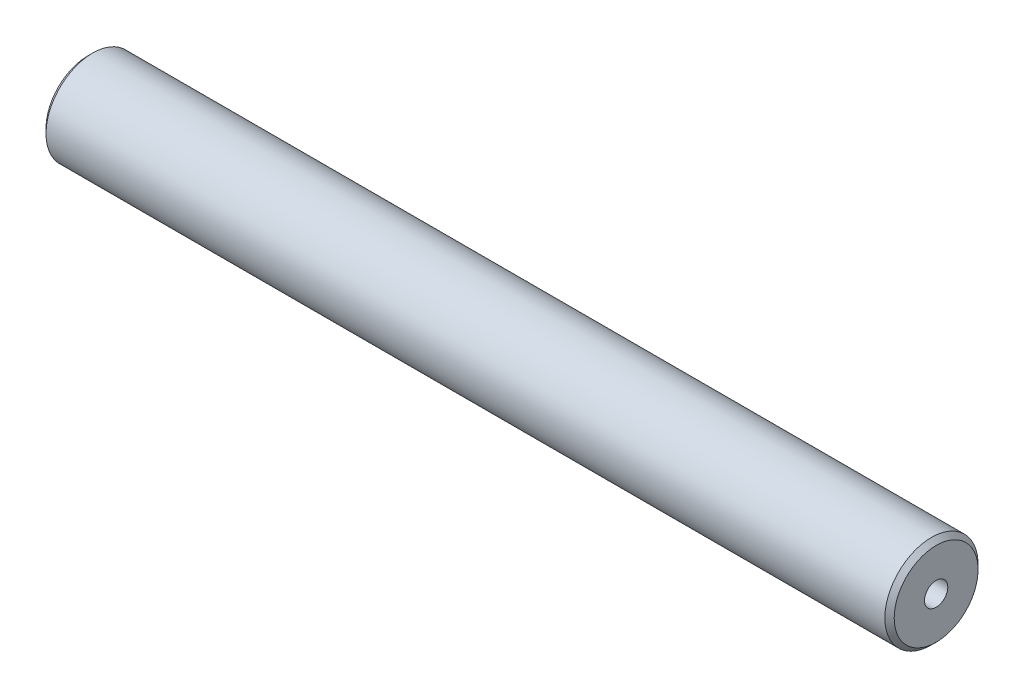
ISO-10303-21;
HEADER;
FILE_DESCRIPTION(('STEP AP214'),'2;1');
FILE_NAME('part.step','',(''),(''),'','','');
FILE_SCHEMA(('AUTOMOTIVE_DESIGN { 1 0 10303 214 1 1 1 1 }'));
ENDSEC;
DATA;
#1=APPLICATION_CONTEXT('core data for automotive mechanical design processes');
#2=APPLICATION_PROTOCOL_DEFINITION('international standard','automotive_design',2000,#1);
#3=PRODUCT_CONTEXT('',#1,'mechanical');
#4=PRODUCT('Part','Part','',(#3));
#5=PRODUCT_RELATED_PRODUCT_CATEGORY('part','',(#4));
#6=PRODUCT_DEFINITION_FORMATION('','',#4);
#7=PRODUCT_DEFINITION_CONTEXT('part definition',#1,'design');
#8=PRODUCT_DEFINITION('design','',#6,#7);
#9=PRODUCT_DEFINITION_SHAPE('','',#8);
#10=(LENGTH_UNIT() NAMED_UNIT(*) SI_UNIT(.MILLI.,.METRE.));
#11=(NAMED_UNIT(*) PLANE_ANGLE_UNIT() SI_UNIT($,.RADIAN.));
#12=(NAMED_UNIT(*) SI_UNIT($,.STERADIAN.) SOLID_ANGLE_UNIT());
#13=UNCERTAINTY_MEASURE_WITH_UNIT(LENGTH_MEASURE(1.E-05),#10,'distance_accuracy_value','');
#14=(GEOMETRIC_REPRESENTATION_CONTEXT(3) GLOBAL_UNCERTAINTY_ASSIGNED_CONTEXT((#13)) GLOBAL_UNIT_ASSIGNED_CONTEXT((#10,
#11,#12)) REPRESENTATION_CONTEXT('',''));
#15=CARTESIAN_POINT('',(0.,0.,0.));
#16=DIRECTION('',(0.,0.,1.));
#17=DIRECTION('',(1.,0.,0.));
#18=AXIS2_PLACEMENT_3D('',#15,#16,#17);
#19=CARTESIAN_POINT('',(0.,0.,0.));
#20=DIRECTION('',(1.,0.,0.));
#21=DIRECTION('',(0.,0.,-1.));
#22=AXIS2_PLACEMENT_3D('',#19,#20,#21);
#23=PLANE('',#22);
#24=CARTESIAN_POINT('',(0.,0.,0.));
#25=DIRECTION('',(-1.,0.,0.));
#26=DIRECTION('',(0.,0.,1.));
#27=AXIS2_PLACEMENT_3D('',#24,#25,#26);
#28=CIRCLE('',#27,2.5);
#29=CARTESIAN_POINT('',(0.,0.,2.5));
#30=VERTEX_POINT('',#29);
#31=EDGE_CURVE('E61',#30,#30,#28,.T.);
#32=ORIENTED_EDGE('',*,*,#31,.F.);
#33=EDGE_LOOP('',(#32));
#34=FACE_BOUND('',#33,.T.);
#35=CARTESIAN_POINT('',(0.,0.,0.));
#36=DIRECTION('',(1.,0.,0.));
#37=DIRECTION('',(0.,0.,-1.));
#38=AXIS2_PLACEMENT_3D('',#35,#36,#37);
#39=CIRCLE('',#38,8.99999999999998);
#40=CARTESIAN_POINT('',(0.,0.,-8.99999999999998));
#41=VERTEX_POINT('',#40);
#42=EDGE_CURVE('E11',#41,#41,#39,.F.);
#43=ORIENTED_EDGE('',*,*,#42,.T.);
#44=EDGE_LOOP('',(#43));
#45=FACE_BOUND('',#44,.T.);
#46=ADVANCED_FACE('F36',(#34,#45),#23,.F.);
#47=CARTESIAN_POINT('',(0.,0.,0.));
#48=DIRECTION('',(-1.,0.,0.));
#49=DIRECTION('',(0.,0.,1.));
#50=AXIS2_PLACEMENT_3D('',#47,#48,#49);
#51=CYLINDRICAL_SURFACE('',#50,10.);
#52=CARTESIAN_POINT('',(181.,0.,0.));
#53=DIRECTION('',(-1.,0.,0.));
#54=DIRECTION('',(0.,0.,1.));
#55=AXIS2_PLACEMENT_3D('',#52,#53,#54);
#56=CIRCLE('',#55,10.);
#57=CARTESIAN_POINT('',(181.,0.,10.));
#58=VERTEX_POINT('',#57);
#59=EDGE_CURVE('E74',#58,#58,#56,.T.);
#60=ORIENTED_EDGE('',*,*,#59,.T.);
#61=EDGE_LOOP('',(#60));
#62=FACE_BOUND('',#61,.T.);
#63=CARTESIAN_POINT('',(0.999999999999999,0.,0.));
#64=DIRECTION('',(1.,0.,0.));
#65=DIRECTION('',(0.,0.,-1.));
#66=AXIS2_PLACEMENT_3D('',#63,#64,#65);
#67=CIRCLE('',#66,10.);
#68=CARTESIAN_POINT('',(0.999999999999999,0.,-10.));
#69=VERTEX_POINT('',#68);
#70=EDGE_CURVE('E71',#69,#69,#67,.T.);
#71=ORIENTED_EDGE('',*,*,#70,.T.);
#72=EDGE_LOOP('',(#71));
#73=FACE_BOUND('',#72,.T.);
#74=ADVANCED_FACE('F86',(#62,#73),#51,.T.);
#75=CARTESIAN_POINT('',(182.,0.,0.));
#76=DIRECTION('',(-1.,0.,0.));
#77=DIRECTION('',(0.,0.,1.));
#78=AXIS2_PLACEMENT_3D('',#75,#76,#77);
#79=PLANE('',#78);
#80=CARTESIAN_POINT('',(182.,0.,0.));
#81=DIRECTION('',(1.,0.,0.));
#82=DIRECTION('',(0.,0.,-1.));
#83=AXIS2_PLACEMENT_3D('',#80,#81,#82);
#84=CIRCLE('',#83,2.5);
#85=CARTESIAN_POINT('',(182.,0.,-2.5));
#86=VERTEX_POINT('',#85);
#87=EDGE_CURVE('E60',#86,#86,#84,.T.);
#88=ORIENTED_EDGE('',*,*,#87,.F.);
#89=EDGE_LOOP('',(#88));
#90=FACE_BOUND('',#89,.T.);
#91=CARTESIAN_POINT('',(182.,0.,0.));
#92=DIRECTION('',(-1.,0.,0.));
#93=DIRECTION('',(0.,0.,1.));
#94=AXIS2_PLACEMENT_3D('',#91,#92,#93);
#95=CIRCLE('',#94,9.00000000000002);
#96=CARTESIAN_POINT('',(182.,0.,9.00000000000002));
#97=VERTEX_POINT('',#96);
#98=EDGE_CURVE('E44',#97,#97,#95,.F.);
#99=ORIENTED_EDGE('',*,*,#98,.T.);
#100=EDGE_LOOP('',(#99));
#101=FACE_BOUND('',#100,.T.);
#102=ADVANCED_FACE('F79',(#90,#101),#79,.F.);
#103=CARTESIAN_POINT('',(181.,0.,0.));
#104=DIRECTION('',(-1.,0.,0.));
#105=DIRECTION('',(0.,0.,1.));
#106=AXIS2_PLACEMENT_3D('',#103,#104,#105);
#107=CONICAL_SURFACE('',#106,10.,0.785398163397451);
#108=ORIENTED_EDGE('',*,*,#98,.F.);
#109=EDGE_LOOP('',(#108));
#110=FACE_BOUND('',#109,.T.);
#111=ORIENTED_EDGE('',*,*,#59,.F.);
#112=EDGE_LOOP('',(#111));
#113=FACE_BOUND('',#112,.T.);
#114=ADVANCED_FACE('F81',(#110,#113),#107,.T.);
#115=CARTESIAN_POINT('',(0.,0.,0.));
#116=DIRECTION('',(1.,0.,0.));
#117=DIRECTION('',(0.,0.,-1.));
#118=AXIS2_PLACEMENT_3D('',#115,#116,#117);
#119=CONICAL_SURFACE('',#118,8.99999999999998,0.785398163397459);
#120=ORIENTED_EDGE('',*,*,#70,.F.);
#121=EDGE_LOOP('',(#120));
#122=FACE_BOUND('',#121,.T.);
#123=ORIENTED_EDGE('',*,*,#42,.F.);
#124=EDGE_LOOP('',(#123));
#125=FACE_BOUND('',#124,.T.);
#126=ADVANCED_FACE('F38',(#122,#125),#119,.T.);
#127=CARTESIAN_POINT('',(165.,0.,0.));
#128=DIRECTION('',(1.,0.,0.));
#129=DIRECTION('',(0.,0.,-1.));
#130=AXIS2_PLACEMENT_3D('',#127,#128,#129);
#131=CONICAL_SURFACE('',#130,2.5,1.02974425867666);
#132=CARTESIAN_POINT('',(163.497848452431,0.,0.));
#133=VERTEX_POINT('',#132);
#134=VERTEX_LOOP('',#133);
#135=FACE_BOUND('',#134,.T.);
#136=CARTESIAN_POINT('',(165.,0.,0.));
#137=DIRECTION('',(1.,0.,0.));
#138=DIRECTION('',(0.,0.,-1.));
#139=AXIS2_PLACEMENT_3D('',#136,#137,#138);
#140=CIRCLE('',#139,2.5);
#141=CARTESIAN_POINT('',(165.,0.,-2.5));
#142=VERTEX_POINT('',#141);
#143=EDGE_CURVE('E64',#142,#142,#140,.T.);
#144=ORIENTED_EDGE('',*,*,#143,.T.);
#145=EDGE_LOOP('',(#144));
#146=FACE_BOUND('',#145,.T.);
#147=ADVANCED_FACE('F94',(#135,#146),#131,.F.);
#148=CARTESIAN_POINT('',(182.,0.,0.));
#149=DIRECTION('',(1.,0.,0.));
#150=DIRECTION('',(0.,0.,-1.));
#151=AXIS2_PLACEMENT_3D('',#148,#149,#150);
#152=CYLINDRICAL_SURFACE('',#151,2.5);
#153=ORIENTED_EDGE('',*,*,#143,.F.);
#154=EDGE_LOOP('',(#153));
#155=FACE_BOUND('',#154,.T.);
#156=ORIENTED_EDGE('',*,*,#87,.T.);
#157=EDGE_LOOP('',(#156));
#158=FACE_BOUND('',#157,.T.);
#159=ADVANCED_FACE('F54',(#155,#158),#152,.F.);
#160=CARTESIAN_POINT('',(17.,0.,0.));
#161=DIRECTION('',(-1.,0.,0.));
#162=DIRECTION('',(0.,0.,1.));
#163=AXIS2_PLACEMENT_3D('',#160,#161,#162);
#164=CONICAL_SURFACE('',#163,2.5,1.02974425867665);
#165=CARTESIAN_POINT('',(18.5021515475689,0.,0.));
#166=VERTEX_POINT('',#165);
#167=VERTEX_LOOP('',#166);
#168=FACE_BOUND('',#167,.T.);
#169=CARTESIAN_POINT('',(17.,0.,0.));
#170=DIRECTION('',(-1.,0.,0.));
#171=DIRECTION('',(0.,0.,1.));
#172=AXIS2_PLACEMENT_3D('',#169,#170,#171);
#173=CIRCLE('',#172,2.5);
#174=CARTESIAN_POINT('',(17.,0.,2.5));
#175=VERTEX_POINT('',#174);
#176=EDGE_CURVE('E58',#175,#175,#173,.T.);
#177=ORIENTED_EDGE('',*,*,#176,.T.);
#178=EDGE_LOOP('',(#177));
#179=FACE_BOUND('',#178,.T.);
#180=ADVANCED_FACE('F50',(#168,#179),#164,.F.);
#181=CARTESIAN_POINT('',(0.,0.,0.));
#182=DIRECTION('',(-1.,0.,0.));
#183=DIRECTION('',(0.,0.,1.));
#184=AXIS2_PLACEMENT_3D('',#181,#182,#183);
#185=CYLINDRICAL_SURFACE('',#184,2.5);
#186=ORIENTED_EDGE('',*,*,#176,.F.);
#187=EDGE_LOOP('',(#186));
#188=FACE_BOUND('',#187,.T.);
#189=ORIENTED_EDGE('',*,*,#31,.T.);
#190=EDGE_LOOP('',(#189));
#191=FACE_BOUND('',#190,.T.);
#192=ADVANCED_FACE('F53',(#188,#191),#185,.F.);
#193=CLOSED_SHELL('',(#46,#74,#102,#114,#126,#147,#159,#180,#192));
#194=MANIFOLD_SOLID_BREP('B2',#193);
#195=ADVANCED_BREP_SHAPE_REPRESENTATION('',(#18,#194),#14);
#196=SHAPE_DEFINITION_REPRESENTATION(#9,#195);
ENDSEC;
END-ISO-10303-21;
